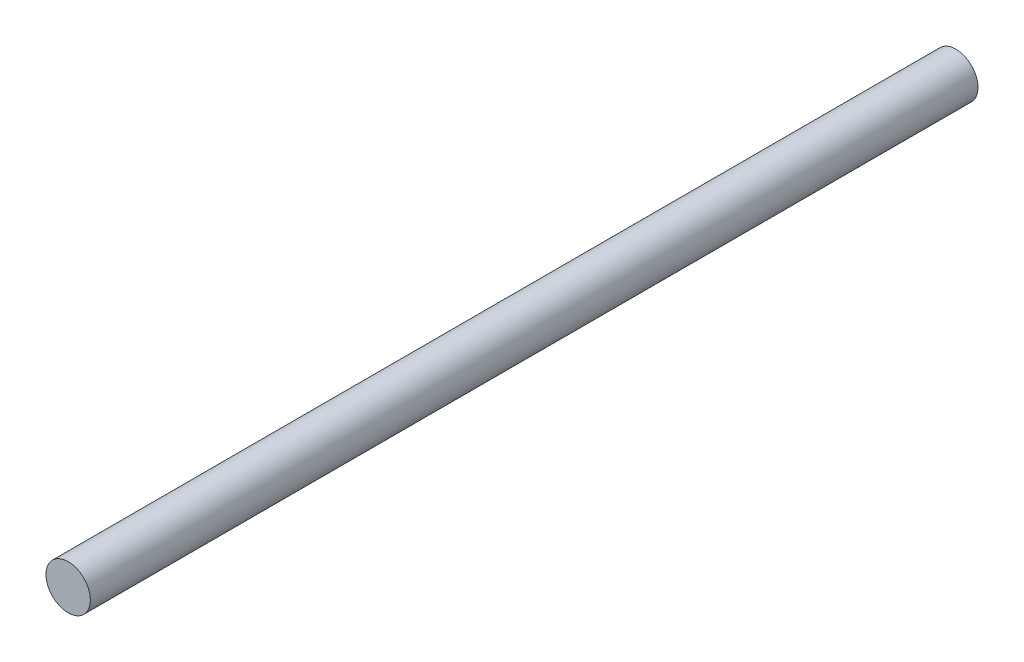
ISO-10303-21;
HEADER;
FILE_DESCRIPTION(('STEP AP214'),'2;1');
FILE_NAME('part.step','',(''),(''),'','','');
FILE_SCHEMA(('AUTOMOTIVE_DESIGN { 1 0 10303 214 1 1 1 1 }'));
ENDSEC;
DATA;
#1=APPLICATION_CONTEXT('core data for automotive mechanical design processes');
#2=APPLICATION_PROTOCOL_DEFINITION('international standard','automotive_design',2000,#1);
#3=PRODUCT_CONTEXT('',#1,'mechanical');
#4=PRODUCT('Part','Part','',(#3));
#5=PRODUCT_RELATED_PRODUCT_CATEGORY('part','',(#4));
#6=PRODUCT_DEFINITION_FORMATION('','',#4);
#7=PRODUCT_DEFINITION_CONTEXT('part definition',#1,'design');
#8=PRODUCT_DEFINITION('design','',#6,#7);
#9=PRODUCT_DEFINITION_SHAPE('','',#8);
#10=(LENGTH_UNIT() NAMED_UNIT(*) SI_UNIT(.MILLI.,.METRE.));
#11=(NAMED_UNIT(*) PLANE_ANGLE_UNIT() SI_UNIT($,.RADIAN.));
#12=(NAMED_UNIT(*) SI_UNIT($,.STERADIAN.) SOLID_ANGLE_UNIT());
#13=UNCERTAINTY_MEASURE_WITH_UNIT(LENGTH_MEASURE(1.E-05),#10,'distance_accuracy_value','');
#14=(GEOMETRIC_REPRESENTATION_CONTEXT(3) GLOBAL_UNCERTAINTY_ASSIGNED_CONTEXT((#13)) GLOBAL_UNIT_ASSIGNED_CONTEXT((#10,
#11,#12)) REPRESENTATION_CONTEXT('',''));
#15=CARTESIAN_POINT('',(0.,0.,0.));
#16=DIRECTION('',(0.,0.,1.));
#17=DIRECTION('',(1.,0.,0.));
#18=AXIS2_PLACEMENT_3D('',#15,#16,#17);
#19=CARTESIAN_POINT('',(0.,0.,300.));
#20=DIRECTION('',(0.,0.,-1.));
#21=DIRECTION('',(-1.,0.,0.));
#22=AXIS2_PLACEMENT_3D('',#19,#20,#21);
#23=CYLINDRICAL_SURFACE('',#22,7.5);
#24=CARTESIAN_POINT('',(0.,0.,300.));
#25=DIRECTION('',(0.,0.,1.));
#26=DIRECTION('',(1.,0.,0.));
#27=AXIS2_PLACEMENT_3D('',#24,#25,#26);
#28=CIRCLE('',#27,7.5);
#29=CARTESIAN_POINT('',(7.5,0.,300.));
#30=VERTEX_POINT('',#29);
#31=EDGE_CURVE('E10',#30,#30,#28,.T.);
#32=ORIENTED_EDGE('',*,*,#31,.F.);
#33=EDGE_LOOP('',(#32));
#34=FACE_BOUND('',#33,.T.);
#35=CARTESIAN_POINT('',(0.,0.,0.));
#36=DIRECTION('',(0.,0.,1.));
#37=DIRECTION('',(1.,0.,0.));
#38=AXIS2_PLACEMENT_3D('',#35,#36,#37);
#39=CIRCLE('',#38,7.5);
#40=CARTESIAN_POINT('',(7.5,0.,0.));
#41=VERTEX_POINT('',#40);
#42=EDGE_CURVE('E42',#41,#41,#39,.T.);
#43=ORIENTED_EDGE('',*,*,#42,.T.);
#44=EDGE_LOOP('',(#43));
#45=FACE_BOUND('',#44,.T.);
#46=ADVANCED_FACE('F39',(#34,#45),#23,.T.);
#47=CARTESIAN_POINT('',(0.,0.,300.));
#48=DIRECTION('',(0.,0.,1.));
#49=DIRECTION('',(1.,0.,0.));
#50=AXIS2_PLACEMENT_3D('',#47,#48,#49);
#51=PLANE('',#50);
#52=ORIENTED_EDGE('',*,*,#31,.T.);
#53=EDGE_LOOP('',(#52));
#54=FACE_BOUND('',#53,.T.);
#55=ADVANCED_FACE('F56',(#54),#51,.T.);
#56=CARTESIAN_POINT('',(0.,0.,0.));
#57=DIRECTION('',(0.,0.,1.));
#58=DIRECTION('',(1.,0.,0.));
#59=AXIS2_PLACEMENT_3D('',#56,#57,#58);
#60=PLANE('',#59);
#61=ORIENTED_EDGE('',*,*,#42,.F.);
#62=EDGE_LOOP('',(#61));
#63=FACE_BOUND('',#62,.T.);
#64=ADVANCED_FACE('F54',(#63),#60,.F.);
#65=CLOSED_SHELL('',(#46,#55,#64));
#66=MANIFOLD_SOLID_BREP('B2',#65);
#67=ADVANCED_BREP_SHAPE_REPRESENTATION('',(#18,#66),#14);
#68=SHAPE_DEFINITION_REPRESENTATION(#9,#67);
ENDSEC;
END-ISO-10303-21;
